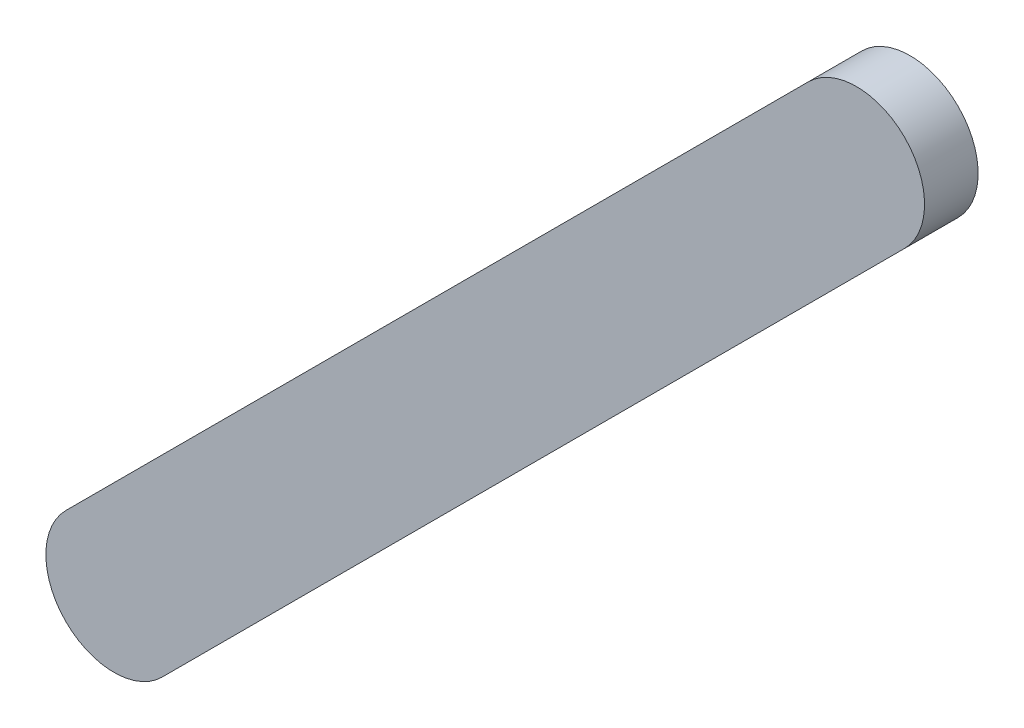
ISO-10303-21;
HEADER;
FILE_DESCRIPTION(('STEP AP214'),'2;1');
FILE_NAME('part.step','',(''),(''),'','','');
FILE_SCHEMA(('AUTOMOTIVE_DESIGN { 1 0 10303 214 1 1 1 1 }'));
ENDSEC;
DATA;
#1=APPLICATION_CONTEXT('core data for automotive mechanical design processes');
#2=APPLICATION_PROTOCOL_DEFINITION('international standard','automotive_design',2000,#1);
#3=PRODUCT_CONTEXT('',#1,'mechanical');
#4=PRODUCT('Part','Part','',(#3));
#5=PRODUCT_RELATED_PRODUCT_CATEGORY('part','',(#4));
#6=PRODUCT_DEFINITION_FORMATION('','',#4);
#7=PRODUCT_DEFINITION_CONTEXT('part definition',#1,'design');
#8=PRODUCT_DEFINITION('design','',#6,#7);
#9=PRODUCT_DEFINITION_SHAPE('','',#8);
#10=(LENGTH_UNIT() NAMED_UNIT(*) SI_UNIT(.MILLI.,.METRE.));
#11=(NAMED_UNIT(*) PLANE_ANGLE_UNIT() SI_UNIT($,.RADIAN.));
#12=(NAMED_UNIT(*) SI_UNIT($,.STERADIAN.) SOLID_ANGLE_UNIT());
#13=UNCERTAINTY_MEASURE_WITH_UNIT(LENGTH_MEASURE(1.E-05),#10,'distance_accuracy_value','');
#14=(GEOMETRIC_REPRESENTATION_CONTEXT(3) GLOBAL_UNCERTAINTY_ASSIGNED_CONTEXT((#13)) GLOBAL_UNIT_ASSIGNED_CONTEXT((#10,
#11,#12)) REPRESENTATION_CONTEXT('',''));
#15=CARTESIAN_POINT('',(0.,0.,0.));
#16=DIRECTION('',(0.,0.,1.));
#17=DIRECTION('',(1.,0.,0.));
#18=AXIS2_PLACEMENT_3D('',#15,#16,#17);
#19=CARTESIAN_POINT('',(94.8417966,53.99498726,0.));
#20=DIRECTION('',(-0.707106457247725,0.707107105125221,0.));
#21=DIRECTION('',(0.707107105125221,0.707106457247725,0.));
#22=AXIS2_PLACEMENT_3D('',#19,#20,#21);
#23=PLANE('',#22);
#24=DIRECTION('',(0.707107105125221,0.707106457247725,0.));
#25=VECTOR('',#24,1.);
#26=CARTESIAN_POINT('',(94.8417966,53.99498726,0.1999996));
#27=LINE('',#26,#25);
#28=CARTESIAN_POINT('',(94.8417966,53.99498726,0.1999996));
#29=VERTEX_POINT('',#28);
#30=CARTESIAN_POINT('',(97.61400594,56.76719406,0.1999996));
#31=VERTEX_POINT('',#30);
#32=EDGE_CURVE('E11',#29,#31,#27,.T.);
#33=ORIENTED_EDGE('',*,*,#32,.F.);
#34=DIRECTION('',(0.,0.,1.));
#35=VECTOR('',#34,1.);
#36=CARTESIAN_POINT('',(94.8417966,53.99498726,0.));
#37=LINE('',#36,#35);
#38=CARTESIAN_POINT('',(94.8417966,53.99498726,0.));
#39=VERTEX_POINT('',#38);
#40=EDGE_CURVE('E24',#39,#29,#37,.T.);
#41=ORIENTED_EDGE('',*,*,#40,.F.);
#42=DIRECTION('',(0.707107105125221,0.707106457247725,0.));
#43=VECTOR('',#42,1.);
#44=CARTESIAN_POINT('',(94.8417966,53.99498726,0.));
#45=LINE('',#44,#43);
#46=CARTESIAN_POINT('',(97.61400594,56.76719406,0.));
#47=VERTEX_POINT('',#46);
#48=EDGE_CURVE('E75',#39,#47,#45,.T.);
#49=ORIENTED_EDGE('',*,*,#48,.T.);
#50=DIRECTION('',(0.,0.,1.));
#51=VECTOR('',#50,1.);
#52=CARTESIAN_POINT('',(97.61400594,56.76719406,0.));
#53=LINE('',#52,#51);
#54=EDGE_CURVE('E37',#47,#31,#53,.T.);
#55=ORIENTED_EDGE('',*,*,#54,.T.);
#56=EDGE_LOOP('',(#33,#41,#49,#55));
#57=FACE_BOUND('',#56,.T.);
#58=ADVANCED_FACE('F17',(#57),#23,.F.);
#59=CARTESIAN_POINT('',(97.4344,56.9468,0.));
#60=DIRECTION('',(0.,0.,-1.));
#61=DIRECTION('',(0.707106781186548,-0.707106781186548,0.));
#62=AXIS2_PLACEMENT_3D('',#59,#60,#61);
#63=CYLINDRICAL_SURFACE('',#62,0.254001156230771);
#64=CARTESIAN_POINT('',(97.4344,56.9468,0.1999996));
#65=DIRECTION('',(0.,0.,1.));
#66=DIRECTION('',(0.707106781186548,-0.707106781186548,0.));
#67=AXIS2_PLACEMENT_3D('',#64,#65,#66);
#68=CIRCLE('',#67,0.254001156230771);
#69=CARTESIAN_POINT('',(97.25479406,57.12640594,0.1999996));
#70=VERTEX_POINT('',#69);
#71=EDGE_CURVE('E83',#31,#70,#68,.T.);
#72=ORIENTED_EDGE('',*,*,#71,.F.);
#73=ORIENTED_EDGE('',*,*,#54,.F.);
#74=CARTESIAN_POINT('',(97.4344,56.9468,0.));
#75=DIRECTION('',(0.,0.,1.));
#76=DIRECTION('',(0.707106781186548,-0.707106781186548,0.));
#77=AXIS2_PLACEMENT_3D('',#74,#75,#76);
#78=CIRCLE('',#77,0.254001156230771);
#79=CARTESIAN_POINT('',(97.25479406,57.12640594,0.));
#80=VERTEX_POINT('',#79);
#81=EDGE_CURVE('E81',#47,#80,#78,.T.);
#82=ORIENTED_EDGE('',*,*,#81,.T.);
#83=DIRECTION('',(0.,0.,1.));
#84=VECTOR('',#83,1.);
#85=CARTESIAN_POINT('',(97.25479406,57.12640594,0.));
#86=LINE('',#85,#84);
#87=EDGE_CURVE('E67',#80,#70,#86,.T.);
#88=ORIENTED_EDGE('',*,*,#87,.T.);
#89=EDGE_LOOP('',(#72,#73,#82,#88));
#90=FACE_BOUND('',#89,.T.);
#91=ADVANCED_FACE('F89',(#90),#63,.T.);
#92=CARTESIAN_POINT('',(97.25479406,57.12640594,0.));
#93=DIRECTION('',(0.707107105125223,-0.707106457247724,0.));
#94=DIRECTION('',(-0.707106457247724,-0.707107105125223,0.));
#95=AXIS2_PLACEMENT_3D('',#92,#93,#94);
#96=PLANE('',#95);
#97=DIRECTION('',(-0.707106457247724,-0.707107105125223,0.));
#98=VECTOR('',#97,1.);
#99=CARTESIAN_POINT('',(97.25479406,57.12640594,0.1999996));
#100=LINE('',#99,#98);
#101=CARTESIAN_POINT('',(94.48258726,54.3541966,0.1999996));
#102=VERTEX_POINT('',#101);
#103=EDGE_CURVE('E71',#70,#102,#100,.T.);
#104=ORIENTED_EDGE('',*,*,#103,.F.);
#105=ORIENTED_EDGE('',*,*,#87,.F.);
#106=DIRECTION('',(-0.707106457247724,-0.707107105125223,0.));
#107=VECTOR('',#106,1.);
#108=CARTESIAN_POINT('',(97.25479406,57.12640594,0.));
#109=LINE('',#108,#107);
#110=CARTESIAN_POINT('',(94.48258726,54.3541966,0.));
#111=VERTEX_POINT('',#110);
#112=EDGE_CURVE('E63',#80,#111,#109,.T.);
#113=ORIENTED_EDGE('',*,*,#112,.T.);
#114=DIRECTION('',(0.,0.,1.));
#115=VECTOR('',#114,1.);
#116=CARTESIAN_POINT('',(94.48258726,54.3541966,0.));
#117=LINE('',#116,#115);
#118=EDGE_CURVE('E53',#111,#102,#117,.T.);
#119=ORIENTED_EDGE('',*,*,#118,.T.);
#120=EDGE_LOOP('',(#104,#105,#113,#119));
#121=FACE_BOUND('',#120,.T.);
#122=ADVANCED_FACE('F66',(#121),#96,.F.);
#123=CARTESIAN_POINT('',(94.66219193,54.17459193,0.));
#124=DIRECTION('',(0.,0.,-1.));
#125=DIRECTION('',(-0.707106781186562,0.707106781186534,0.));
#126=AXIS2_PLACEMENT_3D('',#123,#124,#125);
#127=CYLINDRICAL_SURFACE('',#126,0.253999360179544);
#128=CARTESIAN_POINT('',(94.66219193,54.17459193,0.1999996));
#129=DIRECTION('',(0.,0.,1.));
#130=DIRECTION('',(-0.707106781186562,0.707106781186534,0.));
#131=AXIS2_PLACEMENT_3D('',#128,#129,#130);
#132=CIRCLE('',#131,0.253999360179544);
#133=EDGE_CURVE('E59',#102,#29,#132,.T.);
#134=ORIENTED_EDGE('',*,*,#133,.F.);
#135=ORIENTED_EDGE('',*,*,#118,.F.);
#136=CARTESIAN_POINT('',(94.66219193,54.17459193,0.));
#137=DIRECTION('',(0.,0.,1.));
#138=DIRECTION('',(-0.707106781186562,0.707106781186534,0.));
#139=AXIS2_PLACEMENT_3D('',#136,#137,#138);
#140=CIRCLE('',#139,0.253999360179544);
#141=EDGE_CURVE('E57',#111,#39,#140,.T.);
#142=ORIENTED_EDGE('',*,*,#141,.T.);
#143=ORIENTED_EDGE('',*,*,#40,.T.);
#144=EDGE_LOOP('',(#134,#135,#142,#143));
#145=FACE_BOUND('',#144,.T.);
#146=ADVANCED_FACE('F55',(#145),#127,.T.);
#147=CARTESIAN_POINT('',(94.8417966,53.99498726,0.));
#148=DIRECTION('',(0.,0.,-1.));
#149=DIRECTION('',(-1.,0.,0.));
#150=AXIS2_PLACEMENT_3D('',#147,#148,#149);
#151=PLANE('',#150);
#152=ORIENTED_EDGE('',*,*,#141,.F.);
#153=ORIENTED_EDGE('',*,*,#112,.F.);
#154=ORIENTED_EDGE('',*,*,#81,.F.);
#155=ORIENTED_EDGE('',*,*,#48,.F.);
#156=EDGE_LOOP('',(#152,#153,#154,#155));
#157=FACE_BOUND('',#156,.T.);
#158=ADVANCED_FACE('F74',(#157),#151,.T.);
#159=CARTESIAN_POINT('',(94.8417966,53.99498726,0.1999996));
#160=DIRECTION('',(0.,0.,-1.));
#161=DIRECTION('',(-1.,0.,0.));
#162=AXIS2_PLACEMENT_3D('',#159,#160,#161);
#163=PLANE('',#162);
#164=ORIENTED_EDGE('',*,*,#32,.T.);
#165=ORIENTED_EDGE('',*,*,#71,.T.);
#166=ORIENTED_EDGE('',*,*,#103,.T.);
#167=ORIENTED_EDGE('',*,*,#133,.T.);
#168=EDGE_LOOP('',(#164,#165,#166,#167));
#169=FACE_BOUND('',#168,.T.);
#170=ADVANCED_FACE('F91',(#169),#163,.F.);
#171=CLOSED_SHELL('',(#58,#91,#122,#146,#158,#170));
#172=MANIFOLD_SOLID_BREP('B1',#171);
#173=ADVANCED_BREP_SHAPE_REPRESENTATION('',(#18,#172),#14);
#174=SHAPE_DEFINITION_REPRESENTATION(#9,#173);
ENDSEC;
END-ISO-10303-21;
